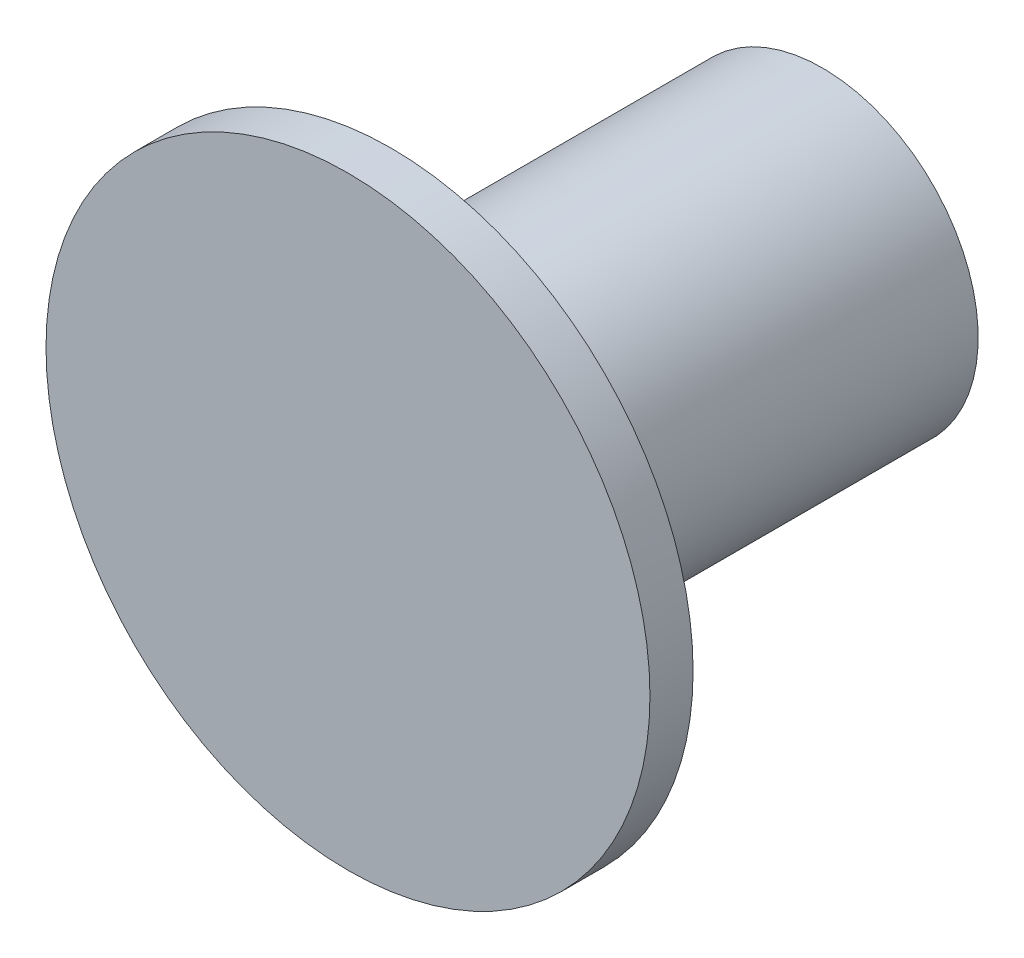
ISO-10303-21;
HEADER;
FILE_DESCRIPTION(('STEP AP214'),'2;1');
FILE_NAME('part.step','',(''),(''),'','','');
FILE_SCHEMA(('AUTOMOTIVE_DESIGN { 1 0 10303 214 1 1 1 1 }'));
ENDSEC;
DATA;
#1=APPLICATION_CONTEXT('core data for automotive mechanical design processes');
#2=APPLICATION_PROTOCOL_DEFINITION('international standard','automotive_design',2000,#1);
#3=PRODUCT_CONTEXT('',#1,'mechanical');
#4=PRODUCT('Part','Part','',(#3));
#5=PRODUCT_RELATED_PRODUCT_CATEGORY('part','',(#4));
#6=PRODUCT_DEFINITION_FORMATION('','',#4);
#7=PRODUCT_DEFINITION_CONTEXT('part definition',#1,'design');
#8=PRODUCT_DEFINITION('design','',#6,#7);
#9=PRODUCT_DEFINITION_SHAPE('','',#8);
#10=(LENGTH_UNIT() NAMED_UNIT(*) SI_UNIT(.MILLI.,.METRE.));
#11=(NAMED_UNIT(*) PLANE_ANGLE_UNIT() SI_UNIT($,.RADIAN.));
#12=(NAMED_UNIT(*) SI_UNIT($,.STERADIAN.) SOLID_ANGLE_UNIT());
#13=UNCERTAINTY_MEASURE_WITH_UNIT(LENGTH_MEASURE(1.E-05),#10,'distance_accuracy_value','');
#14=(GEOMETRIC_REPRESENTATION_CONTEXT(3) GLOBAL_UNCERTAINTY_ASSIGNED_CONTEXT((#13)) GLOBAL_UNIT_ASSIGNED_CONTEXT((#10,
#11,#12)) REPRESENTATION_CONTEXT('',''));
#15=CARTESIAN_POINT('',(0.,0.,0.));
#16=DIRECTION('',(0.,0.,1.));
#17=DIRECTION('',(1.,0.,0.));
#18=AXIS2_PLACEMENT_3D('',#15,#16,#17);
#19=CARTESIAN_POINT('',(0.,0.,6.096));
#20=DIRECTION('',(0.,0.,-1.));
#21=DIRECTION('',(-1.,0.,0.));
#22=AXIS2_PLACEMENT_3D('',#19,#20,#21);
#23=CYLINDRICAL_SURFACE('',#22,0.916592799472306);
#24=CARTESIAN_POINT('',(0.,0.,6.096));
#25=DIRECTION('',(0.,0.,-1.));
#26=DIRECTION('',(-1.,0.,0.));
#27=AXIS2_PLACEMENT_3D('',#24,#25,#26);
#28=CIRCLE('',#27,0.916592799472306);
#29=CARTESIAN_POINT('',(-0.916592799472306,0.,6.096));
#30=VERTEX_POINT('',#29);
#31=EDGE_CURVE('E42',#30,#30,#28,.T.);
#32=ORIENTED_EDGE('',*,*,#31,.T.);
#33=EDGE_LOOP('',(#32));
#34=FACE_BOUND('',#33,.T.);
#35=CARTESIAN_POINT('',(0.,0.,3.556));
#36=DIRECTION('',(0.,0.,-1.));
#37=DIRECTION('',(-1.,0.,0.));
#38=AXIS2_PLACEMENT_3D('',#35,#36,#37);
#39=CIRCLE('',#38,0.916592799472306);
#40=CARTESIAN_POINT('',(-0.916592799472306,0.,3.556));
#41=VERTEX_POINT('',#40);
#42=EDGE_CURVE('E46',#41,#41,#39,.T.);
#43=ORIENTED_EDGE('',*,*,#42,.F.);
#44=EDGE_LOOP('',(#43));
#45=FACE_BOUND('',#44,.T.);
#46=ADVANCED_FACE('F31',(#34,#45),#23,.T.);
#47=CARTESIAN_POINT('',(0.,0.,6.35));
#48=DIRECTION('',(0.,0.,-1.));
#49=DIRECTION('',(-1.,0.,0.));
#50=AXIS2_PLACEMENT_3D('',#47,#48,#49);
#51=CYLINDRICAL_SURFACE('',#50,1.778);
#52=CARTESIAN_POINT('',(0.,0.,6.35));
#53=DIRECTION('',(0.,0.,1.));
#54=DIRECTION('',(1.,0.,0.));
#55=AXIS2_PLACEMENT_3D('',#52,#53,#54);
#56=CIRCLE('',#55,1.778);
#57=CARTESIAN_POINT('',(1.778,0.,6.35));
#58=VERTEX_POINT('',#57);
#59=EDGE_CURVE('E10',#58,#58,#56,.T.);
#60=ORIENTED_EDGE('',*,*,#59,.F.);
#61=EDGE_LOOP('',(#60));
#62=FACE_BOUND('',#61,.T.);
#63=CARTESIAN_POINT('',(0.,0.,6.096));
#64=DIRECTION('',(0.,0.,-1.));
#65=DIRECTION('',(-1.,0.,0.));
#66=AXIS2_PLACEMENT_3D('',#63,#64,#65);
#67=CIRCLE('',#66,1.778);
#68=CARTESIAN_POINT('',(-1.778,0.,6.096));
#69=VERTEX_POINT('',#68);
#70=EDGE_CURVE('E38',#69,#69,#67,.T.);
#71=ORIENTED_EDGE('',*,*,#70,.F.);
#72=EDGE_LOOP('',(#71));
#73=FACE_BOUND('',#72,.T.);
#74=ADVANCED_FACE('F33',(#62,#73),#51,.T.);
#75=CARTESIAN_POINT('',(0.,0.,6.35));
#76=DIRECTION('',(0.,0.,1.));
#77=DIRECTION('',(1.,0.,0.));
#78=AXIS2_PLACEMENT_3D('',#75,#76,#77);
#79=PLANE('',#78);
#80=ORIENTED_EDGE('',*,*,#59,.T.);
#81=EDGE_LOOP('',(#80));
#82=FACE_BOUND('',#81,.T.);
#83=ADVANCED_FACE('F60',(#82),#79,.T.);
#84=CARTESIAN_POINT('',(0.,0.,6.096));
#85=DIRECTION('',(0.,0.,-1.));
#86=DIRECTION('',(-1.,0.,0.));
#87=AXIS2_PLACEMENT_3D('',#84,#85,#86);
#88=PLANE('',#87);
#89=ORIENTED_EDGE('',*,*,#31,.F.);
#90=EDGE_LOOP('',(#89));
#91=FACE_BOUND('',#90,.T.);
#92=ORIENTED_EDGE('',*,*,#70,.T.);
#93=EDGE_LOOP('',(#92));
#94=FACE_BOUND('',#93,.T.);
#95=ADVANCED_FACE('F63',(#91,#94),#88,.T.);
#96=CARTESIAN_POINT('',(0.,0.,3.556));
#97=DIRECTION('',(0.,0.,-1.));
#98=DIRECTION('',(-1.,0.,0.));
#99=AXIS2_PLACEMENT_3D('',#96,#97,#98);
#100=PLANE('',#99);
#101=ORIENTED_EDGE('',*,*,#42,.T.);
#102=EDGE_LOOP('',(#101));
#103=FACE_BOUND('',#102,.T.);
#104=ADVANCED_FACE('F52',(#103),#100,.T.);
#105=CLOSED_SHELL('',(#46,#74,#83,#95,#104));
#106=MANIFOLD_SOLID_BREP('B2',#105);
#107=ADVANCED_BREP_SHAPE_REPRESENTATION('',(#18,#106),#14);
#108=SHAPE_DEFINITION_REPRESENTATION(#9,#107);
ENDSEC;
END-ISO-10303-21;
